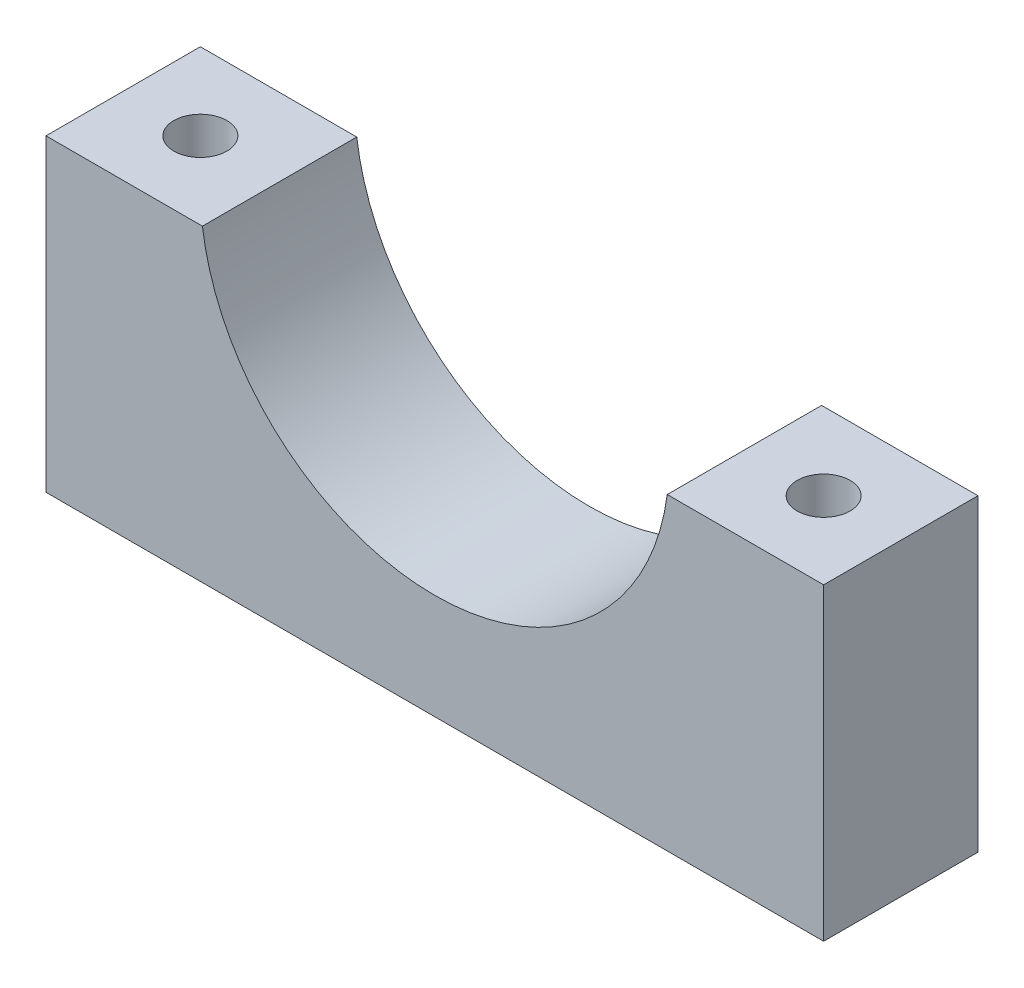
ISO-10303-21;
HEADER;
FILE_DESCRIPTION(('STEP AP214'),'2;1');
FILE_NAME('part.step','',(''),(''),'','','');
FILE_SCHEMA(('AUTOMOTIVE_DESIGN { 1 0 10303 214 1 1 1 1 }'));
ENDSEC;
DATA;
#1=APPLICATION_CONTEXT('core data for automotive mechanical design processes');
#2=APPLICATION_PROTOCOL_DEFINITION('international standard','automotive_design',2000,#1);
#3=PRODUCT_CONTEXT('',#1,'mechanical');
#4=PRODUCT('Part','Part','',(#3));
#5=PRODUCT_RELATED_PRODUCT_CATEGORY('part','',(#4));
#6=PRODUCT_DEFINITION_FORMATION('','',#4);
#7=PRODUCT_DEFINITION_CONTEXT('part definition',#1,'design');
#8=PRODUCT_DEFINITION('design','',#6,#7);
#9=PRODUCT_DEFINITION_SHAPE('','',#8);
#10=(LENGTH_UNIT() NAMED_UNIT(*) SI_UNIT(.MILLI.,.METRE.));
#11=(NAMED_UNIT(*) PLANE_ANGLE_UNIT() SI_UNIT($,.RADIAN.));
#12=(NAMED_UNIT(*) SI_UNIT($,.STERADIAN.) SOLID_ANGLE_UNIT());
#13=UNCERTAINTY_MEASURE_WITH_UNIT(LENGTH_MEASURE(1.E-05),#10,'distance_accuracy_value','');
#14=(GEOMETRIC_REPRESENTATION_CONTEXT(3) GLOBAL_UNCERTAINTY_ASSIGNED_CONTEXT((#13)) GLOBAL_UNIT_ASSIGNED_CONTEXT((#10,
#11,#12)) REPRESENTATION_CONTEXT('',''));
#15=CARTESIAN_POINT('',(0.,0.,0.));
#16=DIRECTION('',(0.,0.,1.));
#17=DIRECTION('',(1.,0.,0.));
#18=AXIS2_PLACEMENT_3D('',#15,#16,#17);
#19=CARTESIAN_POINT('',(-31.9913,-2.54,12.7));
#20=DIRECTION('',(1.,0.,0.));
#21=DIRECTION('',(0.,0.,-1.));
#22=AXIS2_PLACEMENT_3D('',#19,#20,#21);
#23=PLANE('',#22);
#24=DIRECTION('',(0.,-1.,0.));
#25=VECTOR('',#24,1.);
#26=CARTESIAN_POINT('',(-31.9913,-2.54,0.));
#27=LINE('',#26,#25);
#28=CARTESIAN_POINT('',(-31.9913,-2.54,0.));
#29=VERTEX_POINT('',#28);
#30=CARTESIAN_POINT('',(-31.9913,-27.94,0.));
#31=VERTEX_POINT('',#30);
#32=EDGE_CURVE('E116',#29,#31,#27,.T.);
#33=ORIENTED_EDGE('',*,*,#32,.T.);
#34=DIRECTION('',(0.,0.,-1.));
#35=VECTOR('',#34,1.);
#36=CARTESIAN_POINT('',(-31.9913,-27.94,12.7));
#37=LINE('',#36,#35);
#38=CARTESIAN_POINT('',(-31.9913,-27.94,12.7));
#39=VERTEX_POINT('',#38);
#40=EDGE_CURVE('E11',#39,#31,#37,.T.);
#41=ORIENTED_EDGE('',*,*,#40,.F.);
#42=DIRECTION('',(0.,-1.,0.));
#43=VECTOR('',#42,1.);
#44=CARTESIAN_POINT('',(-31.9913,-2.54,12.7));
#45=LINE('',#44,#43);
#46=CARTESIAN_POINT('',(-31.9913,-2.54,12.7));
#47=VERTEX_POINT('',#46);
#48=EDGE_CURVE('E128',#47,#39,#45,.T.);
#49=ORIENTED_EDGE('',*,*,#48,.F.);
#50=DIRECTION('',(0.,0.,-1.));
#51=VECTOR('',#50,1.);
#52=CARTESIAN_POINT('',(-31.9913,-2.54,12.7));
#53=LINE('',#52,#51);
#54=EDGE_CURVE('E112',#47,#29,#53,.T.);
#55=ORIENTED_EDGE('',*,*,#54,.T.);
#56=EDGE_LOOP('',(#33,#41,#49,#55));
#57=FACE_BOUND('',#56,.T.);
#58=ADVANCED_FACE('F33',(#57),#23,.F.);
#59=CARTESIAN_POINT('',(-31.9913,-27.94,12.7));
#60=DIRECTION('',(0.,1.,0.));
#61=DIRECTION('',(-1.,0.,0.));
#62=AXIS2_PLACEMENT_3D('',#59,#60,#61);
#63=PLANE('',#62);
#64=CARTESIAN_POINT('',(25.6413,-27.94,6.34999999999998));
#65=DIRECTION('',(0.,-1.,0.));
#66=DIRECTION('',(1.,0.,0.));
#67=AXIS2_PLACEMENT_3D('',#64,#65,#66);
#68=CIRCLE('',#67,2.1828125);
#69=CARTESIAN_POINT('',(27.8241125,-27.94,6.34999999999998));
#70=VERTEX_POINT('',#69);
#71=EDGE_CURVE('E175',#70,#70,#68,.T.);
#72=ORIENTED_EDGE('',*,*,#71,.F.);
#73=EDGE_LOOP('',(#72));
#74=FACE_BOUND('',#73,.T.);
#75=CARTESIAN_POINT('',(-25.6413,-27.94,6.35));
#76=DIRECTION('',(0.,-1.,0.));
#77=DIRECTION('',(1.,0.,0.));
#78=AXIS2_PLACEMENT_3D('',#75,#76,#77);
#79=CIRCLE('',#78,2.1828125);
#80=CARTESIAN_POINT('',(-23.4584875,-27.94,6.35));
#81=VERTEX_POINT('',#80);
#82=EDGE_CURVE('E174',#81,#81,#79,.T.);
#83=ORIENTED_EDGE('',*,*,#82,.F.);
#84=EDGE_LOOP('',(#83));
#85=FACE_BOUND('',#84,.T.);
#86=DIRECTION('',(1.,0.,0.));
#87=VECTOR('',#86,1.);
#88=CARTESIAN_POINT('',(-31.9913,-27.94,0.));
#89=LINE('',#88,#87);
#90=CARTESIAN_POINT('',(31.9913,-27.94,0.));
#91=VERTEX_POINT('',#90);
#92=EDGE_CURVE('E119',#31,#91,#89,.T.);
#93=ORIENTED_EDGE('',*,*,#92,.T.);
#94=DIRECTION('',(0.,0.,-1.));
#95=VECTOR('',#94,1.);
#96=CARTESIAN_POINT('',(31.9913,-27.94,12.7));
#97=LINE('',#96,#95);
#98=CARTESIAN_POINT('',(31.9913,-27.94,12.7));
#99=VERTEX_POINT('',#98);
#100=EDGE_CURVE('E41',#99,#91,#97,.T.);
#101=ORIENTED_EDGE('',*,*,#100,.F.);
#102=DIRECTION('',(1.,0.,0.));
#103=VECTOR('',#102,1.);
#104=CARTESIAN_POINT('',(-31.9913,-27.94,12.7));
#105=LINE('',#104,#103);
#106=EDGE_CURVE('E82',#39,#99,#105,.T.);
#107=ORIENTED_EDGE('',*,*,#106,.F.);
#108=ORIENTED_EDGE('',*,*,#40,.T.);
#109=EDGE_LOOP('',(#93,#101,#107,#108));
#110=FACE_BOUND('',#109,.T.);
#111=ADVANCED_FACE('F154',(#74,#85,#110),#63,.F.);
#112=CARTESIAN_POINT('',(31.9913,-27.94,12.7));
#113=DIRECTION('',(-1.,0.,0.));
#114=DIRECTION('',(0.,-1.,0.));
#115=AXIS2_PLACEMENT_3D('',#112,#113,#114);
#116=PLANE('',#115);
#117=DIRECTION('',(0.,1.,0.));
#118=VECTOR('',#117,1.);
#119=CARTESIAN_POINT('',(31.9913,-27.94,0.));
#120=LINE('',#119,#118);
#121=CARTESIAN_POINT('',(31.9913,-2.53999999999999,0.));
#122=VERTEX_POINT('',#121);
#123=EDGE_CURVE('E122',#91,#122,#120,.T.);
#124=ORIENTED_EDGE('',*,*,#123,.T.);
#125=DIRECTION('',(0.,0.,-1.));
#126=VECTOR('',#125,1.);
#127=CARTESIAN_POINT('',(31.9913,-2.53999999999999,12.7));
#128=LINE('',#127,#126);
#129=CARTESIAN_POINT('',(31.9913,-2.53999999999999,12.7));
#130=VERTEX_POINT('',#129);
#131=EDGE_CURVE('E108',#130,#122,#128,.T.);
#132=ORIENTED_EDGE('',*,*,#131,.F.);
#133=DIRECTION('',(0.,1.,0.));
#134=VECTOR('',#133,1.);
#135=CARTESIAN_POINT('',(31.9913,-27.94,12.7));
#136=LINE('',#135,#134);
#137=EDGE_CURVE('E95',#99,#130,#136,.T.);
#138=ORIENTED_EDGE('',*,*,#137,.F.);
#139=ORIENTED_EDGE('',*,*,#100,.T.);
#140=EDGE_LOOP('',(#124,#132,#138,#139));
#141=FACE_BOUND('',#140,.T.);
#142=ADVANCED_FACE('F134',(#141),#116,.F.);
#143=CARTESIAN_POINT('',(31.9913,-2.53999999999999,12.7));
#144=DIRECTION('',(0.,-1.,0.));
#145=DIRECTION('',(1.,0.,0.));
#146=AXIS2_PLACEMENT_3D('',#143,#144,#145);
#147=PLANE('',#146);
#148=CARTESIAN_POINT('',(25.6413,-2.53999999999997,6.34999999999998));
#149=DIRECTION('',(0.,-1.,0.));
#150=DIRECTION('',(1.,0.,0.));
#151=AXIS2_PLACEMENT_3D('',#148,#149,#150);
#152=CIRCLE('',#151,2.1828125);
#153=CARTESIAN_POINT('',(27.8241125,-2.53999999999997,6.34999999999998));
#154=VERTEX_POINT('',#153);
#155=EDGE_CURVE('E172',#154,#154,#152,.T.);
#156=ORIENTED_EDGE('',*,*,#155,.T.);
#157=EDGE_LOOP('',(#156));
#158=FACE_BOUND('',#157,.T.);
#159=DIRECTION('',(-1.,0.,0.));
#160=VECTOR('',#159,1.);
#161=CARTESIAN_POINT('',(31.9913,-2.53999999999999,0.));
#162=LINE('',#161,#160);
#163=CARTESIAN_POINT('',(19.1233536726694,-2.54,0.));
#164=VERTEX_POINT('',#163);
#165=EDGE_CURVE('E104',#122,#164,#162,.T.);
#166=ORIENTED_EDGE('',*,*,#165,.T.);
#167=DIRECTION('',(0.,0.,-1.));
#168=VECTOR('',#167,1.);
#169=CARTESIAN_POINT('',(19.1233536726694,-2.54,12.7));
#170=LINE('',#169,#168);
#171=CARTESIAN_POINT('',(19.1233536726694,-2.54,12.7));
#172=VERTEX_POINT('',#171);
#173=EDGE_CURVE('E101',#172,#164,#170,.T.);
#174=ORIENTED_EDGE('',*,*,#173,.F.);
#175=DIRECTION('',(-1.,0.,0.));
#176=VECTOR('',#175,1.);
#177=CARTESIAN_POINT('',(31.9913,-2.53999999999999,12.7));
#178=LINE('',#177,#176);
#179=EDGE_CURVE('E89',#130,#172,#178,.T.);
#180=ORIENTED_EDGE('',*,*,#179,.F.);
#181=ORIENTED_EDGE('',*,*,#131,.T.);
#182=EDGE_LOOP('',(#166,#174,#180,#181));
#183=FACE_BOUND('',#182,.T.);
#184=ADVANCED_FACE('F102',(#158,#183),#147,.F.);
#185=CARTESIAN_POINT('',(0.,0.,12.7));
#186=DIRECTION('',(0.,0.,-1.));
#187=DIRECTION('',(-1.,0.,0.));
#188=AXIS2_PLACEMENT_3D('',#185,#186,#187);
#189=CYLINDRICAL_SURFACE('',#188,19.2913);
#190=CARTESIAN_POINT('',(0.,0.,0.));
#191=DIRECTION('',(0.,0.,1.));
#192=DIRECTION('',(1.,0.,0.));
#193=AXIS2_PLACEMENT_3D('',#190,#191,#192);
#194=CIRCLE('',#193,19.2913);
#195=CARTESIAN_POINT('',(-19.1233536726694,-2.53999999999999,0.));
#196=VERTEX_POINT('',#195);
#197=EDGE_CURVE('E125',#196,#164,#194,.T.);
#198=ORIENTED_EDGE('',*,*,#197,.F.);
#199=DIRECTION('',(0.,0.,-1.));
#200=VECTOR('',#199,1.);
#201=CARTESIAN_POINT('',(-19.1233536726694,-2.53999999999999,12.7));
#202=LINE('',#201,#200);
#203=CARTESIAN_POINT('',(-19.1233536726694,-2.53999999999999,12.7));
#204=VERTEX_POINT('',#203);
#205=EDGE_CURVE('E71',#204,#196,#202,.T.);
#206=ORIENTED_EDGE('',*,*,#205,.F.);
#207=CARTESIAN_POINT('',(0.,0.,12.7));
#208=DIRECTION('',(0.,0.,1.));
#209=DIRECTION('',(1.,0.,0.));
#210=AXIS2_PLACEMENT_3D('',#207,#208,#209);
#211=CIRCLE('',#210,19.2913);
#212=EDGE_CURVE('E93',#204,#172,#211,.T.);
#213=ORIENTED_EDGE('',*,*,#212,.T.);
#214=ORIENTED_EDGE('',*,*,#173,.T.);
#215=EDGE_LOOP('',(#198,#206,#213,#214));
#216=FACE_BOUND('',#215,.T.);
#217=ADVANCED_FACE('F110',(#216),#189,.F.);
#218=CARTESIAN_POINT('',(-19.1233536726694,-2.54,12.7));
#219=DIRECTION('',(0.,-1.,0.));
#220=DIRECTION('',(0.,0.,-1.));
#221=AXIS2_PLACEMENT_3D('',#218,#219,#220);
#222=PLANE('',#221);
#223=CARTESIAN_POINT('',(-25.6413,-2.53999999999999,6.35));
#224=DIRECTION('',(0.,-1.,0.));
#225=DIRECTION('',(1.,0.,0.));
#226=AXIS2_PLACEMENT_3D('',#223,#224,#225);
#227=CIRCLE('',#226,2.1828125);
#228=CARTESIAN_POINT('',(-23.4584875,-2.53999999999999,6.35));
#229=VERTEX_POINT('',#228);
#230=EDGE_CURVE('E120',#229,#229,#227,.T.);
#231=ORIENTED_EDGE('',*,*,#230,.T.);
#232=EDGE_LOOP('',(#231));
#233=FACE_BOUND('',#232,.T.);
#234=DIRECTION('',(-1.,0.,0.));
#235=VECTOR('',#234,1.);
#236=CARTESIAN_POINT('',(-19.1233536726694,-2.54,0.));
#237=LINE('',#236,#235);
#238=EDGE_CURVE('E74',#196,#29,#237,.T.);
#239=ORIENTED_EDGE('',*,*,#238,.T.);
#240=ORIENTED_EDGE('',*,*,#54,.F.);
#241=DIRECTION('',(-1.,0.,0.));
#242=VECTOR('',#241,1.);
#243=CARTESIAN_POINT('',(-19.1233536726694,-2.54,12.7));
#244=LINE('',#243,#242);
#245=EDGE_CURVE('E49',#204,#47,#244,.T.);
#246=ORIENTED_EDGE('',*,*,#245,.F.);
#247=ORIENTED_EDGE('',*,*,#205,.T.);
#248=EDGE_LOOP('',(#239,#240,#246,#247));
#249=FACE_BOUND('',#248,.T.);
#250=ADVANCED_FACE('F141',(#233,#249),#222,.F.);
#251=CARTESIAN_POINT('',(0.,0.,12.7));
#252=DIRECTION('',(0.,0.,1.));
#253=DIRECTION('',(1.,0.,0.));
#254=AXIS2_PLACEMENT_3D('',#251,#252,#253);
#255=PLANE('',#254);
#256=ORIENTED_EDGE('',*,*,#48,.T.);
#257=ORIENTED_EDGE('',*,*,#106,.T.);
#258=ORIENTED_EDGE('',*,*,#137,.T.);
#259=ORIENTED_EDGE('',*,*,#179,.T.);
#260=ORIENTED_EDGE('',*,*,#212,.F.);
#261=ORIENTED_EDGE('',*,*,#245,.T.);
#262=EDGE_LOOP('',(#256,#257,#258,#259,#260,#261));
#263=FACE_BOUND('',#262,.T.);
#264=ADVANCED_FACE('F91',(#263),#255,.T.);
#265=CARTESIAN_POINT('',(0.,0.,0.));
#266=DIRECTION('',(0.,0.,1.));
#267=DIRECTION('',(1.,0.,0.));
#268=AXIS2_PLACEMENT_3D('',#265,#266,#267);
#269=PLANE('',#268);
#270=ORIENTED_EDGE('',*,*,#32,.F.);
#271=ORIENTED_EDGE('',*,*,#238,.F.);
#272=ORIENTED_EDGE('',*,*,#197,.T.);
#273=ORIENTED_EDGE('',*,*,#165,.F.);
#274=ORIENTED_EDGE('',*,*,#123,.F.);
#275=ORIENTED_EDGE('',*,*,#92,.F.);
#276=EDGE_LOOP('',(#270,#271,#272,#273,#274,#275));
#277=FACE_BOUND('',#276,.T.);
#278=ADVANCED_FACE('F137',(#277),#269,.F.);
#279=CARTESIAN_POINT('',(-25.6413,-2.53999999999999,6.35));
#280=DIRECTION('',(0.,-1.,0.));
#281=DIRECTION('',(1.,0.,0.));
#282=AXIS2_PLACEMENT_3D('',#279,#280,#281);
#283=CYLINDRICAL_SURFACE('',#282,2.1828125);
#284=ORIENTED_EDGE('',*,*,#230,.F.);
#285=EDGE_LOOP('',(#284));
#286=FACE_BOUND('',#285,.T.);
#287=ORIENTED_EDGE('',*,*,#82,.T.);
#288=EDGE_LOOP('',(#287));
#289=FACE_BOUND('',#288,.T.);
#290=ADVANCED_FACE('F186',(#286,#289),#283,.F.);
#291=CARTESIAN_POINT('',(25.6413,-2.53999999999997,6.34999999999998));
#292=DIRECTION('',(0.,-1.,0.));
#293=DIRECTION('',(1.,0.,0.));
#294=AXIS2_PLACEMENT_3D('',#291,#292,#293);
#295=CYLINDRICAL_SURFACE('',#294,2.1828125);
#296=ORIENTED_EDGE('',*,*,#155,.F.);
#297=EDGE_LOOP('',(#296));
#298=FACE_BOUND('',#297,.T.);
#299=ORIENTED_EDGE('',*,*,#71,.T.);
#300=EDGE_LOOP('',(#299));
#301=FACE_BOUND('',#300,.T.);
#302=ADVANCED_FACE('F189',(#298,#301),#295,.F.);
#303=CLOSED_SHELL('',(#58,#111,#142,#184,#217,#250,#264,#278,#290,#302));
#304=MANIFOLD_SOLID_BREP('B2',#303);
#305=ADVANCED_BREP_SHAPE_REPRESENTATION('',(#18,#304),#14);
#306=SHAPE_DEFINITION_REPRESENTATION(#9,#305);
ENDSEC;
END-ISO-10303-21;
